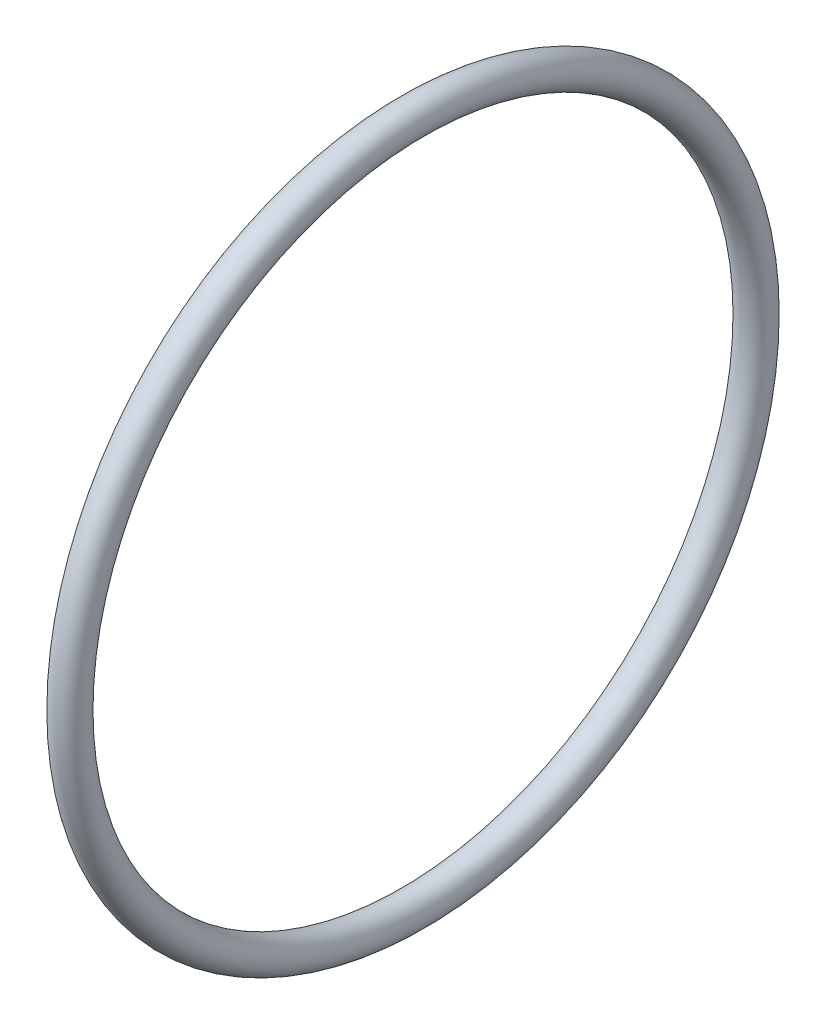
ISO-10303-21;
HEADER;
FILE_DESCRIPTION(('STEP AP214'),'2;1');
FILE_NAME('part.step','',(''),(''),'','','');
FILE_SCHEMA(('AUTOMOTIVE_DESIGN { 1 0 10303 214 1 1 1 1 }'));
ENDSEC;
DATA;
#1=APPLICATION_CONTEXT('core data for automotive mechanical design processes');
#2=APPLICATION_PROTOCOL_DEFINITION('international standard','automotive_design',2000,#1);
#3=PRODUCT_CONTEXT('',#1,'mechanical');
#4=PRODUCT('Part','Part','',(#3));
#5=PRODUCT_RELATED_PRODUCT_CATEGORY('part','',(#4));
#6=PRODUCT_DEFINITION_FORMATION('','',#4);
#7=PRODUCT_DEFINITION_CONTEXT('part definition',#1,'design');
#8=PRODUCT_DEFINITION('design','',#6,#7);
#9=PRODUCT_DEFINITION_SHAPE('','',#8);
#10=(LENGTH_UNIT() NAMED_UNIT(*) SI_UNIT(.MILLI.,.METRE.));
#11=(NAMED_UNIT(*) PLANE_ANGLE_UNIT() SI_UNIT($,.RADIAN.));
#12=(NAMED_UNIT(*) SI_UNIT($,.STERADIAN.) SOLID_ANGLE_UNIT());
#13=UNCERTAINTY_MEASURE_WITH_UNIT(LENGTH_MEASURE(1.E-05),#10,'distance_accuracy_value','');
#14=(GEOMETRIC_REPRESENTATION_CONTEXT(3) GLOBAL_UNCERTAINTY_ASSIGNED_CONTEXT((#13)) GLOBAL_UNIT_ASSIGNED_CONTEXT((#10,
#11,#12)) REPRESENTATION_CONTEXT('',''));
#15=CARTESIAN_POINT('',(0.,0.,0.));
#16=DIRECTION('',(0.,0.,1.));
#17=DIRECTION('',(1.,0.,0.));
#18=AXIS2_PLACEMENT_3D('',#15,#16,#17);
#19=CARTESIAN_POINT('',(0.,-15.75,0.));
#20=DIRECTION('',(-1.,0.,0.));
#21=DIRECTION('',(0.,0.,1.));
#22=AXIS2_PLACEMENT_3D('',#19,#20,#21);
#23=TOROIDAL_SURFACE('',#22,15.75,0.75);
#24=CARTESIAN_POINT('',(0.,-15.75,16.5));
#25=VERTEX_POINT('',#24);
#26=VERTEX_LOOP('',#25);
#27=FACE_BOUND('',#26,.T.);
#28=ADVANCED_FACE('F37',(#27),#23,.T.);
#29=CLOSED_SHELL('',(#28));
#30=MANIFOLD_SOLID_BREP('B2',#29);
#31=ADVANCED_BREP_SHAPE_REPRESENTATION('',(#18,#30),#14);
#32=SHAPE_DEFINITION_REPRESENTATION(#9,#31);
ENDSEC;
END-ISO-10303-21;
